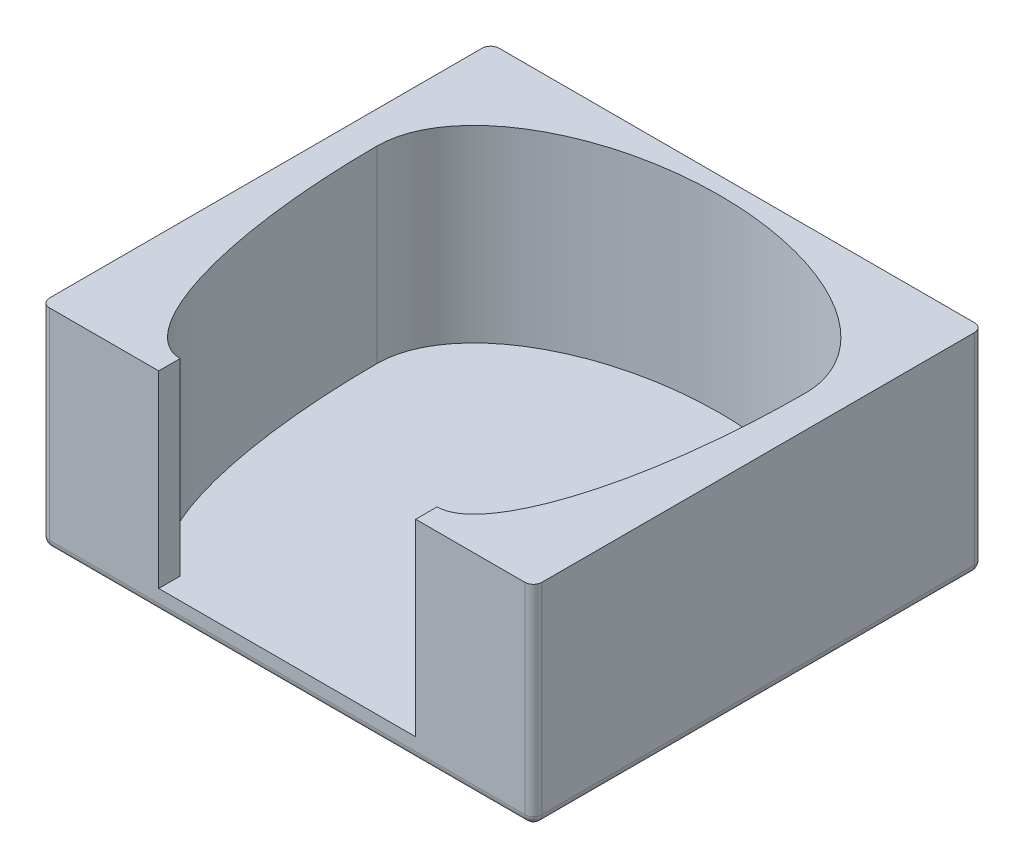
ISO-10303-21;
HEADER;
FILE_DESCRIPTION(('STEP AP214'),'2;1');
FILE_NAME('part.step','',(''),(''),'','','');
FILE_SCHEMA(('AUTOMOTIVE_DESIGN { 1 0 10303 214 1 1 1 1 }'));
ENDSEC;
DATA;
#1=APPLICATION_CONTEXT('core data for automotive mechanical design processes');
#2=APPLICATION_PROTOCOL_DEFINITION('international standard','automotive_design',2000,#1);
#3=PRODUCT_CONTEXT('',#1,'mechanical');
#4=PRODUCT('Part','Part','',(#3));
#5=PRODUCT_RELATED_PRODUCT_CATEGORY('part','',(#4));
#6=PRODUCT_DEFINITION_FORMATION('','',#4);
#7=PRODUCT_DEFINITION_CONTEXT('part definition',#1,'design');
#8=PRODUCT_DEFINITION('design','',#6,#7);
#9=PRODUCT_DEFINITION_SHAPE('','',#8);
#10=(LENGTH_UNIT() NAMED_UNIT(*) SI_UNIT(.MILLI.,.METRE.));
#11=(NAMED_UNIT(*) PLANE_ANGLE_UNIT() SI_UNIT($,.RADIAN.));
#12=(NAMED_UNIT(*) SI_UNIT($,.STERADIAN.) SOLID_ANGLE_UNIT());
#13=UNCERTAINTY_MEASURE_WITH_UNIT(LENGTH_MEASURE(1.E-05),#10,'distance_accuracy_value','');
#14=(GEOMETRIC_REPRESENTATION_CONTEXT(3) GLOBAL_UNCERTAINTY_ASSIGNED_CONTEXT((#13)) GLOBAL_UNIT_ASSIGNED_CONTEXT((#10,
#11,#12)) REPRESENTATION_CONTEXT('',''));
#15=CARTESIAN_POINT('',(0.,0.,0.));
#16=DIRECTION('',(0.,0.,1.));
#17=DIRECTION('',(1.,0.,0.));
#18=AXIS2_PLACEMENT_3D('',#15,#16,#17);
#19=CARTESIAN_POINT('',(-28.75,2.5,26.25));
#20=DIRECTION('',(1.,0.,0.));
#21=DIRECTION('',(0.,0.,-1.));
#22=AXIS2_PLACEMENT_3D('',#19,#20,#21);
#23=PLANE('',#22);
#24=DIRECTION('',(0.,0.,1.));
#25=VECTOR('',#24,1.);
#26=CARTESIAN_POINT('',(-28.75,1.,26.25));
#27=LINE('',#26,#25);
#28=CARTESIAN_POINT('',(-28.75,1.,-25.25));
#29=VERTEX_POINT('',#28);
#30=CARTESIAN_POINT('',(-28.75,1.,25.25));
#31=VERTEX_POINT('',#30);
#32=EDGE_CURVE('E377',#29,#31,#27,.T.);
#33=ORIENTED_EDGE('',*,*,#32,.T.);
#34=DIRECTION('',(0.,-1.,0.));
#35=VECTOR('',#34,1.);
#36=CARTESIAN_POINT('',(-28.75,2.5,25.25));
#37=LINE('',#36,#35);
#38=CARTESIAN_POINT('',(-28.75,24.5,25.25));
#39=VERTEX_POINT('',#38);
#40=EDGE_CURVE('E380',#31,#39,#37,.F.);
#41=ORIENTED_EDGE('',*,*,#40,.T.);
#42=DIRECTION('',(0.,0.,1.));
#43=VECTOR('',#42,1.);
#44=CARTESIAN_POINT('',(-28.75,24.5,0.));
#45=LINE('',#44,#43);
#46=CARTESIAN_POINT('',(-28.75,24.5,-25.25));
#47=VERTEX_POINT('',#46);
#48=EDGE_CURVE('E417',#47,#39,#45,.T.);
#49=ORIENTED_EDGE('',*,*,#48,.F.);
#50=DIRECTION('',(0.,-1.,0.));
#51=VECTOR('',#50,1.);
#52=CARTESIAN_POINT('',(-28.75,2.5,-25.25));
#53=LINE('',#52,#51);
#54=EDGE_CURVE('E374',#47,#29,#53,.T.);
#55=ORIENTED_EDGE('',*,*,#54,.T.);
#56=EDGE_LOOP('',(#33,#41,#49,#55));
#57=FACE_BOUND('',#56,.T.);
#58=ADVANCED_FACE('F41',(#57),#23,.F.);
#59=CARTESIAN_POINT('',(28.75,2.5,26.25));
#60=DIRECTION('',(0.,0.,-1.));
#61=DIRECTION('',(-1.,0.,0.));
#62=AXIS2_PLACEMENT_3D('',#59,#60,#61);
#63=PLANE('',#62);
#64=DIRECTION('',(1.,0.,0.));
#65=VECTOR('',#64,1.);
#66=CARTESIAN_POINT('',(0.,24.5,26.25));
#67=LINE('',#66,#65);
#68=CARTESIAN_POINT('',(-27.75,24.5,26.25));
#69=VERTEX_POINT('',#68);
#70=CARTESIAN_POINT('',(-15.,24.5,26.25));
#71=VERTEX_POINT('',#70);
#72=EDGE_CURVE('E423',#69,#71,#67,.T.);
#73=ORIENTED_EDGE('',*,*,#72,.F.);
#74=DIRECTION('',(0.,-1.,0.));
#75=VECTOR('',#74,1.);
#76=CARTESIAN_POINT('',(-27.75,2.5,26.25));
#77=LINE('',#76,#75);
#78=CARTESIAN_POINT('',(-27.75,1.,26.25));
#79=VERTEX_POINT('',#78);
#80=EDGE_CURVE('E370',#69,#79,#77,.T.);
#81=ORIENTED_EDGE('',*,*,#80,.T.);
#82=DIRECTION('',(1.,0.,0.));
#83=VECTOR('',#82,1.);
#84=CARTESIAN_POINT('',(28.75,1.,26.25));
#85=LINE('',#84,#83);
#86=CARTESIAN_POINT('',(27.75,1.,26.25));
#87=VERTEX_POINT('',#86);
#88=EDGE_CURVE('E364',#79,#87,#85,.T.);
#89=ORIENTED_EDGE('',*,*,#88,.T.);
#90=DIRECTION('',(0.,-1.,0.));
#91=VECTOR('',#90,1.);
#92=CARTESIAN_POINT('',(27.75,2.5,26.25));
#93=LINE('',#92,#91);
#94=CARTESIAN_POINT('',(27.75,24.5,26.25));
#95=VERTEX_POINT('',#94);
#96=EDGE_CURVE('E367',#87,#95,#93,.F.);
#97=ORIENTED_EDGE('',*,*,#96,.T.);
#98=CARTESIAN_POINT('',(15.,24.5,26.25));
#99=VERTEX_POINT('',#98);
#100=EDGE_CURVE('E428',#99,#95,#67,.T.);
#101=ORIENTED_EDGE('',*,*,#100,.F.);
#102=DIRECTION('',(0.,-1.,0.));
#103=VECTOR('',#102,1.);
#104=CARTESIAN_POINT('',(15.,24.5,26.25));
#105=LINE('',#104,#103);
#106=CARTESIAN_POINT('',(15.,2.5,26.25));
#107=VERTEX_POINT('',#106);
#108=EDGE_CURVE('E352',#99,#107,#105,.T.);
#109=ORIENTED_EDGE('',*,*,#108,.T.);
#110=DIRECTION('',(1.,0.,0.));
#111=VECTOR('',#110,1.);
#112=CARTESIAN_POINT('',(28.75,2.5,26.25));
#113=LINE('',#112,#111);
#114=CARTESIAN_POINT('',(-15.,2.5,26.25));
#115=VERTEX_POINT('',#114);
#116=EDGE_CURVE('E166',#115,#107,#113,.T.);
#117=ORIENTED_EDGE('',*,*,#116,.F.);
#118=DIRECTION('',(0.,-1.,0.));
#119=VECTOR('',#118,1.);
#120=CARTESIAN_POINT('',(-15.,24.5,26.25));
#121=LINE('',#120,#119);
#122=EDGE_CURVE('E348',#71,#115,#121,.T.);
#123=ORIENTED_EDGE('',*,*,#122,.F.);
#124=EDGE_LOOP('',(#73,#81,#89,#97,#101,#109,#117,#123));
#125=FACE_BOUND('',#124,.T.);
#126=ADVANCED_FACE('F212',(#125),#63,.F.);
#127=CARTESIAN_POINT('',(28.75,2.5,26.25));
#128=DIRECTION('',(-1.,0.,0.));
#129=DIRECTION('',(0.,0.,1.));
#130=AXIS2_PLACEMENT_3D('',#127,#128,#129);
#131=PLANE('',#130);
#132=DIRECTION('',(0.,0.,-1.));
#133=VECTOR('',#132,1.);
#134=CARTESIAN_POINT('',(28.75,1.,26.25));
#135=LINE('',#134,#133);
#136=CARTESIAN_POINT('',(28.75,1.,25.25));
#137=VERTEX_POINT('',#136);
#138=CARTESIAN_POINT('',(28.75,1.,-25.25));
#139=VERTEX_POINT('',#138);
#140=EDGE_CURVE('E51',#137,#139,#135,.T.);
#141=ORIENTED_EDGE('',*,*,#140,.T.);
#142=DIRECTION('',(0.,-1.,0.));
#143=VECTOR('',#142,1.);
#144=CARTESIAN_POINT('',(28.75,2.5,-25.25));
#145=LINE('',#144,#143);
#146=CARTESIAN_POINT('',(28.75,24.5,-25.25));
#147=VERTEX_POINT('',#146);
#148=EDGE_CURVE('E11',#139,#147,#145,.F.);
#149=ORIENTED_EDGE('',*,*,#148,.T.);
#150=DIRECTION('',(0.,0.,-1.));
#151=VECTOR('',#150,1.);
#152=CARTESIAN_POINT('',(28.75,24.5,0.));
#153=LINE('',#152,#151);
#154=CARTESIAN_POINT('',(28.75,24.5,25.25));
#155=VERTEX_POINT('',#154);
#156=EDGE_CURVE('E429',#155,#147,#153,.T.);
#157=ORIENTED_EDGE('',*,*,#156,.F.);
#158=DIRECTION('',(0.,-1.,0.));
#159=VECTOR('',#158,1.);
#160=CARTESIAN_POINT('',(28.75,2.5,25.25));
#161=LINE('',#160,#159);
#162=EDGE_CURVE('E62',#155,#137,#161,.T.);
#163=ORIENTED_EDGE('',*,*,#162,.T.);
#164=EDGE_LOOP('',(#141,#149,#157,#163));
#165=FACE_BOUND('',#164,.T.);
#166=ADVANCED_FACE('F208',(#165),#131,.F.);
#167=CARTESIAN_POINT('',(28.75,2.5,-26.25));
#168=DIRECTION('',(0.,0.,1.));
#169=DIRECTION('',(1.,0.,0.));
#170=AXIS2_PLACEMENT_3D('',#167,#168,#169);
#171=PLANE('',#170);
#172=DIRECTION('',(-1.,0.,0.));
#173=VECTOR('',#172,1.);
#174=CARTESIAN_POINT('',(28.75,1.,-26.25));
#175=LINE('',#174,#173);
#176=CARTESIAN_POINT('',(27.75,1.,-26.25));
#177=VERTEX_POINT('',#176);
#178=CARTESIAN_POINT('',(-27.75,1.,-26.25));
#179=VERTEX_POINT('',#178);
#180=EDGE_CURVE('E280',#177,#179,#175,.T.);
#181=ORIENTED_EDGE('',*,*,#180,.T.);
#182=DIRECTION('',(0.,-1.,0.));
#183=VECTOR('',#182,1.);
#184=CARTESIAN_POINT('',(-27.75,2.5,-26.25));
#185=LINE('',#184,#183);
#186=CARTESIAN_POINT('',(-27.75,24.5,-26.25));
#187=VERTEX_POINT('',#186);
#188=EDGE_CURVE('E286',#179,#187,#185,.F.);
#189=ORIENTED_EDGE('',*,*,#188,.T.);
#190=DIRECTION('',(-1.,0.,0.));
#191=VECTOR('',#190,1.);
#192=CARTESIAN_POINT('',(0.,24.5,-26.25));
#193=LINE('',#192,#191);
#194=CARTESIAN_POINT('',(27.75,24.5,-26.25));
#195=VERTEX_POINT('',#194);
#196=EDGE_CURVE('E424',#195,#187,#193,.T.);
#197=ORIENTED_EDGE('',*,*,#196,.F.);
#198=DIRECTION('',(0.,-1.,0.));
#199=VECTOR('',#198,1.);
#200=CARTESIAN_POINT('',(27.75,2.5,-26.25));
#201=LINE('',#200,#199);
#202=EDGE_CURVE('E287',#195,#177,#201,.T.);
#203=ORIENTED_EDGE('',*,*,#202,.T.);
#204=EDGE_LOOP('',(#181,#189,#197,#203));
#205=FACE_BOUND('',#204,.T.);
#206=ADVANCED_FACE('F201',(#205),#171,.F.);
#207=CARTESIAN_POINT('',(0.,2.5,0.));
#208=DIRECTION('',(0.,1.,0.));
#209=DIRECTION('',(0.,0.,1.));
#210=AXIS2_PLACEMENT_3D('',#207,#208,#209);
#211=PLANE('',#210);
#212=CARTESIAN_POINT('',(-15.,2.5,-9.25000000000001));
#213=DIRECTION('',(0.,1.,0.));
#214=DIRECTION('',(0.,0.,1.));
#215=AXIS2_PLACEMENT_3D('',#212,#213,#214);
#216=ELLIPSE('',#215,33.,10.);
#217=CARTESIAN_POINT('',(-25.,2.5,-9.25000000000001));
#218=VERTEX_POINT('',#217);
#219=CARTESIAN_POINT('',(-15.,2.5,23.75));
#220=VERTEX_POINT('',#219);
#221=EDGE_CURVE('E162',#218,#220,#216,.T.);
#222=ORIENTED_EDGE('',*,*,#221,.T.);
#223=DIRECTION('',(0.,0.,1.));
#224=VECTOR('',#223,1.);
#225=CARTESIAN_POINT('',(-15.,2.5,0.));
#226=LINE('',#225,#224);
#227=EDGE_CURVE('E184',#220,#115,#226,.T.);
#228=ORIENTED_EDGE('',*,*,#227,.T.);
#229=ORIENTED_EDGE('',*,*,#116,.T.);
#230=DIRECTION('',(0.,0.,1.));
#231=VECTOR('',#230,1.);
#232=CARTESIAN_POINT('',(15.,2.5,0.));
#233=LINE('',#232,#231);
#234=CARTESIAN_POINT('',(15.,2.5,23.75));
#235=VERTEX_POINT('',#234);
#236=EDGE_CURVE('E187',#235,#107,#233,.T.);
#237=ORIENTED_EDGE('',*,*,#236,.F.);
#238=CARTESIAN_POINT('',(15.,2.5,-9.25000000000001));
#239=DIRECTION('',(0.,1.,0.));
#240=DIRECTION('',(0.,0.,-1.));
#241=AXIS2_PLACEMENT_3D('',#238,#239,#240);
#242=ELLIPSE('',#241,33.,10.);
#243=CARTESIAN_POINT('',(25.,2.5,-9.25));
#244=VERTEX_POINT('',#243);
#245=EDGE_CURVE('E335',#235,#244,#242,.T.);
#246=ORIENTED_EDGE('',*,*,#245,.T.);
#247=CARTESIAN_POINT('',(0.,2.5,-9.25000000000001));
#248=DIRECTION('',(0.,-1.,0.));
#249=DIRECTION('',(-1.,0.,0.));
#250=AXIS2_PLACEMENT_3D('',#247,#248,#249);
#251=ELLIPSE('',#250,25.,15.);
#252=EDGE_CURVE('E332',#218,#244,#251,.T.);
#253=ORIENTED_EDGE('',*,*,#252,.F.);
#254=EDGE_LOOP('',(#222,#228,#229,#237,#246,#253));
#255=FACE_BOUND('',#254,.T.);
#256=ADVANCED_FACE('F198',(#255),#211,.T.);
#257=CARTESIAN_POINT('',(0.,0.,0.));
#258=DIRECTION('',(0.,1.,0.));
#259=DIRECTION('',(0.,0.,1.));
#260=AXIS2_PLACEMENT_3D('',#257,#258,#259);
#261=PLANE('',#260);
#262=DIRECTION('',(1.,0.,0.));
#263=VECTOR('',#262,1.);
#264=CARTESIAN_POINT('',(0.,0.,25.25));
#265=LINE('',#264,#263);
#266=CARTESIAN_POINT('',(27.75,0.,25.25));
#267=VERTEX_POINT('',#266);
#268=CARTESIAN_POINT('',(-27.75,0.,25.25));
#269=VERTEX_POINT('',#268);
#270=EDGE_CURVE('E395',#267,#269,#265,.F.);
#271=ORIENTED_EDGE('',*,*,#270,.T.);
#272=DIRECTION('',(0.,0.,1.));
#273=VECTOR('',#272,1.);
#274=CARTESIAN_POINT('',(-27.75,0.,0.));
#275=LINE('',#274,#273);
#276=CARTESIAN_POINT('',(-27.75,0.,-25.25));
#277=VERTEX_POINT('',#276);
#278=EDGE_CURVE('E292',#269,#277,#275,.F.);
#279=ORIENTED_EDGE('',*,*,#278,.T.);
#280=DIRECTION('',(-1.,0.,0.));
#281=VECTOR('',#280,1.);
#282=CARTESIAN_POINT('',(0.,0.,-25.25));
#283=LINE('',#282,#281);
#284=CARTESIAN_POINT('',(27.75,0.,-25.25));
#285=VERTEX_POINT('',#284);
#286=EDGE_CURVE('E401',#277,#285,#283,.F.);
#287=ORIENTED_EDGE('',*,*,#286,.T.);
#288=DIRECTION('',(0.,0.,-1.));
#289=VECTOR('',#288,1.);
#290=CARTESIAN_POINT('',(27.75,0.,0.));
#291=LINE('',#290,#289);
#292=EDGE_CURVE('E398',#285,#267,#291,.F.);
#293=ORIENTED_EDGE('',*,*,#292,.T.);
#294=EDGE_LOOP('',(#271,#279,#287,#293));
#295=FACE_BOUND('',#294,.T.);
#296=ADVANCED_FACE('F196',(#295),#261,.F.);
#297=CARTESIAN_POINT('',(-15.,24.5,-9.25000000000001));
#298=DIRECTION('',(0.,1.,0.));
#299=DIRECTION('',(0.,0.,1.));
#300=AXIS2_PLACEMENT_3D('',#297,#298,#299);
#301=ELLIPSE('',#300,33.,10.);
#302=DIRECTION('',(0.,-1.,0.));
#303=VECTOR('',#302,1.);
#304=SURFACE_OF_LINEAR_EXTRUSION('',#301,#303);
#305=ORIENTED_EDGE('',*,*,#221,.F.);
#306=DIRECTION('',(0.,-1.,0.));
#307=VECTOR('',#306,1.);
#308=CARTESIAN_POINT('',(-25.,24.5,-9.25000000000001));
#309=LINE('',#308,#307);
#310=CARTESIAN_POINT('',(-25.,24.5,-9.25000000000001));
#311=VERTEX_POINT('',#310);
#312=EDGE_CURVE('E155',#311,#218,#309,.T.);
#313=ORIENTED_EDGE('',*,*,#312,.F.);
#314=CARTESIAN_POINT('',(-15.,24.5,23.75));
#315=VERTEX_POINT('',#314);
#316=EDGE_CURVE('E160',#311,#315,#301,.T.);
#317=ORIENTED_EDGE('',*,*,#316,.T.);
#318=DIRECTION('',(0.,-1.,0.));
#319=VECTOR('',#318,1.);
#320=CARTESIAN_POINT('',(-15.,24.5,23.75));
#321=LINE('',#320,#319);
#322=EDGE_CURVE('E345',#315,#220,#321,.T.);
#323=ORIENTED_EDGE('',*,*,#322,.T.);
#324=EDGE_LOOP('',(#305,#313,#317,#323));
#325=FACE_BOUND('',#324,.T.);
#326=ADVANCED_FACE('F157',(#325),#304,.T.);
#327=CARTESIAN_POINT('',(0.,24.5,-9.25000000000001));
#328=DIRECTION('',(0.,-1.,0.));
#329=DIRECTION('',(-1.,0.,0.));
#330=AXIS2_PLACEMENT_3D('',#327,#328,#329);
#331=ELLIPSE('',#330,25.,15.);
#332=DIRECTION('',(0.,-1.,0.));
#333=VECTOR('',#332,1.);
#334=SURFACE_OF_LINEAR_EXTRUSION('',#331,#333);
#335=ORIENTED_EDGE('',*,*,#252,.T.);
#336=DIRECTION('',(0.,-1.,0.));
#337=VECTOR('',#336,1.);
#338=CARTESIAN_POINT('',(25.,24.5,-9.25));
#339=LINE('',#338,#337);
#340=CARTESIAN_POINT('',(25.,24.5,-9.25));
#341=VERTEX_POINT('',#340);
#342=EDGE_CURVE('E167',#341,#244,#339,.T.);
#343=ORIENTED_EDGE('',*,*,#342,.F.);
#344=EDGE_CURVE('E170',#311,#341,#331,.T.);
#345=ORIENTED_EDGE('',*,*,#344,.F.);
#346=ORIENTED_EDGE('',*,*,#312,.T.);
#347=EDGE_LOOP('',(#335,#343,#345,#346));
#348=FACE_BOUND('',#347,.T.);
#349=ADVANCED_FACE('F171',(#348),#334,.F.);
#350=CARTESIAN_POINT('',(15.,24.5,-9.25000000000001));
#351=DIRECTION('',(0.,1.,0.));
#352=DIRECTION('',(0.,0.,-1.));
#353=AXIS2_PLACEMENT_3D('',#350,#351,#352);
#354=ELLIPSE('',#353,33.,10.);
#355=DIRECTION('',(0.,-1.,0.));
#356=VECTOR('',#355,1.);
#357=SURFACE_OF_LINEAR_EXTRUSION('',#354,#356);
#358=ORIENTED_EDGE('',*,*,#245,.F.);
#359=DIRECTION('',(0.,-1.,0.));
#360=VECTOR('',#359,1.);
#361=CARTESIAN_POINT('',(15.,24.5,23.75));
#362=LINE('',#361,#360);
#363=CARTESIAN_POINT('',(15.,24.5,23.75));
#364=VERTEX_POINT('',#363);
#365=EDGE_CURVE('E356',#364,#235,#362,.T.);
#366=ORIENTED_EDGE('',*,*,#365,.F.);
#367=EDGE_CURVE('E177',#364,#341,#354,.T.);
#368=ORIENTED_EDGE('',*,*,#367,.T.);
#369=ORIENTED_EDGE('',*,*,#342,.T.);
#370=EDGE_LOOP('',(#358,#366,#368,#369));
#371=FACE_BOUND('',#370,.T.);
#372=ADVANCED_FACE('F441',(#371),#357,.T.);
#373=CARTESIAN_POINT('',(15.,24.5,0.));
#374=DIRECTION('',(1.,0.,0.));
#375=DIRECTION('',(0.,0.,-1.));
#376=AXIS2_PLACEMENT_3D('',#373,#374,#375);
#377=PLANE('',#376);
#378=ORIENTED_EDGE('',*,*,#236,.T.);
#379=ORIENTED_EDGE('',*,*,#108,.F.);
#380=DIRECTION('',(0.,0.,1.));
#381=VECTOR('',#380,1.);
#382=CARTESIAN_POINT('',(15.,24.5,0.));
#383=LINE('',#382,#381);
#384=EDGE_CURVE('E437',#364,#99,#383,.T.);
#385=ORIENTED_EDGE('',*,*,#384,.F.);
#386=ORIENTED_EDGE('',*,*,#365,.T.);
#387=EDGE_LOOP('',(#378,#379,#385,#386));
#388=FACE_BOUND('',#387,.T.);
#389=ADVANCED_FACE('F444',(#388),#377,.F.);
#390=CARTESIAN_POINT('',(-15.,24.5,0.));
#391=DIRECTION('',(1.,0.,0.));
#392=DIRECTION('',(0.,0.,-1.));
#393=AXIS2_PLACEMENT_3D('',#390,#391,#392);
#394=PLANE('',#393);
#395=ORIENTED_EDGE('',*,*,#227,.F.);
#396=ORIENTED_EDGE('',*,*,#322,.F.);
#397=DIRECTION('',(0.,0.,1.));
#398=VECTOR('',#397,1.);
#399=CARTESIAN_POINT('',(-15.,24.5,0.));
#400=LINE('',#399,#398);
#401=EDGE_CURVE('E182',#315,#71,#400,.T.);
#402=ORIENTED_EDGE('',*,*,#401,.T.);
#403=ORIENTED_EDGE('',*,*,#122,.T.);
#404=EDGE_LOOP('',(#395,#396,#402,#403));
#405=FACE_BOUND('',#404,.T.);
#406=ADVANCED_FACE('F448',(#405),#394,.T.);
#407=CARTESIAN_POINT('',(0.,24.5,0.));
#408=DIRECTION('',(0.,1.,0.));
#409=DIRECTION('',(0.,0.,1.));
#410=AXIS2_PLACEMENT_3D('',#407,#408,#409);
#411=PLANE('',#410);
#412=ORIENTED_EDGE('',*,*,#48,.T.);
#413=CARTESIAN_POINT('',(-27.75,24.5,25.25));
#414=DIRECTION('',(0.,1.,0.));
#415=DIRECTION('',(0.,0.,1.));
#416=AXIS2_PLACEMENT_3D('',#413,#414,#415);
#417=CIRCLE('',#416,1.);
#418=EDGE_CURVE('E392',#39,#69,#417,.T.);
#419=ORIENTED_EDGE('',*,*,#418,.T.);
#420=ORIENTED_EDGE('',*,*,#72,.T.);
#421=ORIENTED_EDGE('',*,*,#401,.F.);
#422=ORIENTED_EDGE('',*,*,#316,.F.);
#423=ORIENTED_EDGE('',*,*,#344,.T.);
#424=ORIENTED_EDGE('',*,*,#367,.F.);
#425=ORIENTED_EDGE('',*,*,#384,.T.);
#426=ORIENTED_EDGE('',*,*,#100,.T.);
#427=CARTESIAN_POINT('',(27.75,24.5,25.25));
#428=DIRECTION('',(0.,1.,0.));
#429=DIRECTION('',(0.,0.,1.));
#430=AXIS2_PLACEMENT_3D('',#427,#428,#429);
#431=CIRCLE('',#430,1.);
#432=EDGE_CURVE('E383',#95,#155,#431,.T.);
#433=ORIENTED_EDGE('',*,*,#432,.T.);
#434=ORIENTED_EDGE('',*,*,#156,.T.);
#435=CARTESIAN_POINT('',(27.75,24.5,-25.25));
#436=DIRECTION('',(0.,1.,0.));
#437=DIRECTION('',(0.,0.,1.));
#438=AXIS2_PLACEMENT_3D('',#435,#436,#437);
#439=CIRCLE('',#438,1.);
#440=EDGE_CURVE('E386',#147,#195,#439,.T.);
#441=ORIENTED_EDGE('',*,*,#440,.T.);
#442=ORIENTED_EDGE('',*,*,#196,.T.);
#443=CARTESIAN_POINT('',(-27.75,24.5,-25.25));
#444=DIRECTION('',(0.,1.,0.));
#445=DIRECTION('',(0.,0.,1.));
#446=AXIS2_PLACEMENT_3D('',#443,#444,#445);
#447=CIRCLE('',#446,1.);
#448=EDGE_CURVE('E389',#187,#47,#447,.T.);
#449=ORIENTED_EDGE('',*,*,#448,.T.);
#450=EDGE_LOOP('',(#412,#419,#420,#421,#422,#423,#424,#425,#426,#433,#434,#441,#442,#449));
#451=FACE_BOUND('',#450,.T.);
#452=ADVANCED_FACE('F180',(#451),#411,.T.);
#453=CARTESIAN_POINT('',(27.75,2.5,-25.25));
#454=DIRECTION('',(0.,-1.,0.));
#455=DIRECTION('',(0.,0.,-1.));
#456=AXIS2_PLACEMENT_3D('',#453,#454,#455);
#457=CYLINDRICAL_SURFACE('',#456,1.);
#458=CARTESIAN_POINT('',(27.75,1.,-25.25));
#459=DIRECTION('',(0.,-1.,0.));
#460=DIRECTION('',(0.,0.,-1.));
#461=AXIS2_PLACEMENT_3D('',#458,#459,#460);
#462=CIRCLE('',#461,1.);
#463=EDGE_CURVE('E45',#177,#139,#462,.T.);
#464=ORIENTED_EDGE('',*,*,#463,.F.);
#465=ORIENTED_EDGE('',*,*,#202,.F.);
#466=ORIENTED_EDGE('',*,*,#440,.F.);
#467=ORIENTED_EDGE('',*,*,#148,.F.);
#468=EDGE_LOOP('',(#464,#465,#466,#467));
#469=FACE_BOUND('',#468,.T.);
#470=ADVANCED_FACE('F43',(#469),#457,.T.);
#471=CARTESIAN_POINT('',(27.75,1.,-25.25));
#472=DIRECTION('',(1.,0.,0.));
#473=DIRECTION('',(0.,0.,-1.));
#474=AXIS2_PLACEMENT_3D('',#471,#472,#473);
#475=SPHERICAL_SURFACE('',#474,1.);
#476=CARTESIAN_POINT('',(27.75,1.,-25.25));
#477=DIRECTION('',(1.,0.,0.));
#478=DIRECTION('',(0.,0.,-1.));
#479=AXIS2_PLACEMENT_3D('',#476,#477,#478);
#480=CIRCLE('',#479,1.);
#481=EDGE_CURVE('E269',#177,#285,#480,.F.);
#482=ORIENTED_EDGE('',*,*,#481,.F.);
#483=ORIENTED_EDGE('',*,*,#463,.T.);
#484=CARTESIAN_POINT('',(27.75,1.,-25.25));
#485=DIRECTION('',(0.,0.,-1.));
#486=DIRECTION('',(-1.,0.,0.));
#487=AXIS2_PLACEMENT_3D('',#484,#485,#486);
#488=CIRCLE('',#487,1.);
#489=EDGE_CURVE('E273',#285,#139,#488,.F.);
#490=ORIENTED_EDGE('',*,*,#489,.F.);
#491=EDGE_LOOP('',(#482,#483,#490));
#492=FACE_BOUND('',#491,.T.);
#493=ADVANCED_FACE('F257',(#492),#475,.T.);
#494=CARTESIAN_POINT('',(27.75,2.5,25.25));
#495=DIRECTION('',(0.,-1.,0.));
#496=DIRECTION('',(0.,0.,-1.));
#497=AXIS2_PLACEMENT_3D('',#494,#495,#496);
#498=CYLINDRICAL_SURFACE('',#497,1.);
#499=ORIENTED_EDGE('',*,*,#432,.F.);
#500=ORIENTED_EDGE('',*,*,#96,.F.);
#501=CARTESIAN_POINT('',(27.75,1.,25.25));
#502=DIRECTION('',(0.,-1.,0.));
#503=DIRECTION('',(0.,0.,-1.));
#504=AXIS2_PLACEMENT_3D('',#501,#502,#503);
#505=CIRCLE('',#504,1.);
#506=EDGE_CURVE('E277',#137,#87,#505,.T.);
#507=ORIENTED_EDGE('',*,*,#506,.F.);
#508=ORIENTED_EDGE('',*,*,#162,.F.);
#509=EDGE_LOOP('',(#499,#500,#507,#508));
#510=FACE_BOUND('',#509,.T.);
#511=ADVANCED_FACE('F254',(#510),#498,.T.);
#512=CARTESIAN_POINT('',(27.75,1.,26.25));
#513=DIRECTION('',(0.,0.,-1.));
#514=DIRECTION('',(-1.,0.,0.));
#515=AXIS2_PLACEMENT_3D('',#512,#513,#514);
#516=CYLINDRICAL_SURFACE('',#515,1.);
#517=ORIENTED_EDGE('',*,*,#489,.T.);
#518=ORIENTED_EDGE('',*,*,#140,.F.);
#519=CARTESIAN_POINT('',(27.75,1.,25.25));
#520=DIRECTION('',(0.,0.,1.));
#521=DIRECTION('',(1.,0.,0.));
#522=AXIS2_PLACEMENT_3D('',#519,#520,#521);
#523=CIRCLE('',#522,1.);
#524=EDGE_CURVE('E323',#267,#137,#523,.T.);
#525=ORIENTED_EDGE('',*,*,#524,.F.);
#526=ORIENTED_EDGE('',*,*,#292,.F.);
#527=EDGE_LOOP('',(#517,#518,#525,#526));
#528=FACE_BOUND('',#527,.T.);
#529=ADVANCED_FACE('F250',(#528),#516,.T.);
#530=CARTESIAN_POINT('',(28.75,1.,-25.25));
#531=DIRECTION('',(-1.,0.,0.));
#532=DIRECTION('',(0.,0.,1.));
#533=AXIS2_PLACEMENT_3D('',#530,#531,#532);
#534=CYLINDRICAL_SURFACE('',#533,1.);
#535=ORIENTED_EDGE('',*,*,#481,.T.);
#536=ORIENTED_EDGE('',*,*,#286,.F.);
#537=CARTESIAN_POINT('',(-27.75,1.,-25.25));
#538=DIRECTION('',(-1.,0.,0.));
#539=DIRECTION('',(0.,0.,1.));
#540=AXIS2_PLACEMENT_3D('',#537,#538,#539);
#541=CIRCLE('',#540,1.);
#542=EDGE_CURVE('E282',#179,#277,#541,.T.);
#543=ORIENTED_EDGE('',*,*,#542,.F.);
#544=ORIENTED_EDGE('',*,*,#180,.F.);
#545=EDGE_LOOP('',(#535,#536,#543,#544));
#546=FACE_BOUND('',#545,.T.);
#547=ADVANCED_FACE('F246',(#546),#534,.T.);
#548=CARTESIAN_POINT('',(-27.75,2.5,-25.25));
#549=DIRECTION('',(0.,-1.,0.));
#550=DIRECTION('',(0.,0.,-1.));
#551=AXIS2_PLACEMENT_3D('',#548,#549,#550);
#552=CYLINDRICAL_SURFACE('',#551,1.);
#553=ORIENTED_EDGE('',*,*,#448,.F.);
#554=ORIENTED_EDGE('',*,*,#188,.F.);
#555=CARTESIAN_POINT('',(-27.75,1.,-25.25));
#556=DIRECTION('',(0.,-1.,0.));
#557=DIRECTION('',(0.,0.,-1.));
#558=AXIS2_PLACEMENT_3D('',#555,#556,#557);
#559=CIRCLE('',#558,1.);
#560=EDGE_CURVE('E318',#29,#179,#559,.T.);
#561=ORIENTED_EDGE('',*,*,#560,.F.);
#562=ORIENTED_EDGE('',*,*,#54,.F.);
#563=EDGE_LOOP('',(#553,#554,#561,#562));
#564=FACE_BOUND('',#563,.T.);
#565=ADVANCED_FACE('F242',(#564),#552,.T.);
#566=CARTESIAN_POINT('',(27.75,1.,25.25));
#567=DIRECTION('',(1.,0.,0.));
#568=DIRECTION('',(0.,0.,-1.));
#569=AXIS2_PLACEMENT_3D('',#566,#567,#568);
#570=SPHERICAL_SURFACE('',#569,1.);
#571=ORIENTED_EDGE('',*,*,#524,.T.);
#572=ORIENTED_EDGE('',*,*,#506,.T.);
#573=CARTESIAN_POINT('',(27.75,1.,25.25));
#574=DIRECTION('',(1.,0.,0.));
#575=DIRECTION('',(0.,0.,-1.));
#576=AXIS2_PLACEMENT_3D('',#573,#574,#575);
#577=CIRCLE('',#576,1.);
#578=EDGE_CURVE('E314',#267,#87,#577,.F.);
#579=ORIENTED_EDGE('',*,*,#578,.F.);
#580=EDGE_LOOP('',(#571,#572,#579));
#581=FACE_BOUND('',#580,.T.);
#582=ADVANCED_FACE('F238',(#581),#570,.T.);
#583=CARTESIAN_POINT('',(-27.75,1.,-25.25));
#584=DIRECTION('',(0.,0.,-1.));
#585=DIRECTION('',(-1.,0.,0.));
#586=AXIS2_PLACEMENT_3D('',#583,#584,#585);
#587=SPHERICAL_SURFACE('',#586,1.);
#588=ORIENTED_EDGE('',*,*,#560,.T.);
#589=ORIENTED_EDGE('',*,*,#542,.T.);
#590=CARTESIAN_POINT('',(-27.75,1.,-25.25));
#591=DIRECTION('',(0.,0.,-1.));
#592=DIRECTION('',(-1.,0.,0.));
#593=AXIS2_PLACEMENT_3D('',#590,#591,#592);
#594=CIRCLE('',#593,1.);
#595=EDGE_CURVE('E311',#29,#277,#594,.F.);
#596=ORIENTED_EDGE('',*,*,#595,.F.);
#597=EDGE_LOOP('',(#588,#589,#596));
#598=FACE_BOUND('',#597,.T.);
#599=ADVANCED_FACE('F234',(#598),#587,.T.);
#600=CARTESIAN_POINT('',(28.75,1.,25.25));
#601=DIRECTION('',(1.,0.,0.));
#602=DIRECTION('',(0.,0.,-1.));
#603=AXIS2_PLACEMENT_3D('',#600,#601,#602);
#604=CYLINDRICAL_SURFACE('',#603,1.);
#605=ORIENTED_EDGE('',*,*,#578,.T.);
#606=ORIENTED_EDGE('',*,*,#88,.F.);
#607=CARTESIAN_POINT('',(-27.75,1.,25.25));
#608=DIRECTION('',(-1.,0.,0.));
#609=DIRECTION('',(0.,0.,1.));
#610=AXIS2_PLACEMENT_3D('',#607,#608,#609);
#611=CIRCLE('',#610,1.);
#612=EDGE_CURVE('E307',#269,#79,#611,.T.);
#613=ORIENTED_EDGE('',*,*,#612,.F.);
#614=ORIENTED_EDGE('',*,*,#270,.F.);
#615=EDGE_LOOP('',(#605,#606,#613,#614));
#616=FACE_BOUND('',#615,.T.);
#617=ADVANCED_FACE('F230',(#616),#604,.T.);
#618=CARTESIAN_POINT('',(-27.75,1.,26.25));
#619=DIRECTION('',(0.,0.,1.));
#620=DIRECTION('',(1.,0.,0.));
#621=AXIS2_PLACEMENT_3D('',#618,#619,#620);
#622=CYLINDRICAL_SURFACE('',#621,1.);
#623=ORIENTED_EDGE('',*,*,#595,.T.);
#624=ORIENTED_EDGE('',*,*,#278,.F.);
#625=CARTESIAN_POINT('',(-27.75,1.,25.25));
#626=DIRECTION('',(0.,0.,1.));
#627=DIRECTION('',(1.,0.,0.));
#628=AXIS2_PLACEMENT_3D('',#625,#626,#627);
#629=CIRCLE('',#628,1.);
#630=EDGE_CURVE('E303',#31,#269,#629,.T.);
#631=ORIENTED_EDGE('',*,*,#630,.F.);
#632=ORIENTED_EDGE('',*,*,#32,.F.);
#633=EDGE_LOOP('',(#623,#624,#631,#632));
#634=FACE_BOUND('',#633,.T.);
#635=ADVANCED_FACE('F226',(#634),#622,.T.);
#636=CARTESIAN_POINT('',(-27.75,1.,25.25));
#637=DIRECTION('',(0.,-1.,0.));
#638=DIRECTION('',(0.,0.,-1.));
#639=AXIS2_PLACEMENT_3D('',#636,#637,#638);
#640=SPHERICAL_SURFACE('',#639,1.);
#641=ORIENTED_EDGE('',*,*,#630,.T.);
#642=ORIENTED_EDGE('',*,*,#612,.T.);
#643=CARTESIAN_POINT('',(-27.75,1.,25.25));
#644=DIRECTION('',(0.,-1.,0.));
#645=DIRECTION('',(0.,0.,-1.));
#646=AXIS2_PLACEMENT_3D('',#643,#644,#645);
#647=CIRCLE('',#646,1.);
#648=EDGE_CURVE('E300',#31,#79,#647,.F.);
#649=ORIENTED_EDGE('',*,*,#648,.F.);
#650=EDGE_LOOP('',(#641,#642,#649));
#651=FACE_BOUND('',#650,.T.);
#652=ADVANCED_FACE('F222',(#651),#640,.T.);
#653=CARTESIAN_POINT('',(-27.75,2.5,25.25));
#654=DIRECTION('',(0.,-1.,0.));
#655=DIRECTION('',(0.,0.,-1.));
#656=AXIS2_PLACEMENT_3D('',#653,#654,#655);
#657=CYLINDRICAL_SURFACE('',#656,1.);
#658=ORIENTED_EDGE('',*,*,#418,.F.);
#659=ORIENTED_EDGE('',*,*,#40,.F.);
#660=ORIENTED_EDGE('',*,*,#648,.T.);
#661=ORIENTED_EDGE('',*,*,#80,.F.);
#662=EDGE_LOOP('',(#658,#659,#660,#661));
#663=FACE_BOUND('',#662,.T.);
#664=ADVANCED_FACE('F219',(#663),#657,.T.);
#665=CLOSED_SHELL('',(#58,#126,#166,#206,#256,#296,#326,#349,#372,#389,#406,#452,#470,#493,#511,
#529,#547,#565,#582,#599,#617,#635,#652,#664));
#666=MANIFOLD_SOLID_BREP('B2',#665);
#667=ADVANCED_BREP_SHAPE_REPRESENTATION('',(#18,#666),#14);
#668=SHAPE_DEFINITION_REPRESENTATION(#9,#667);
ENDSEC;
END-ISO-10303-21;
